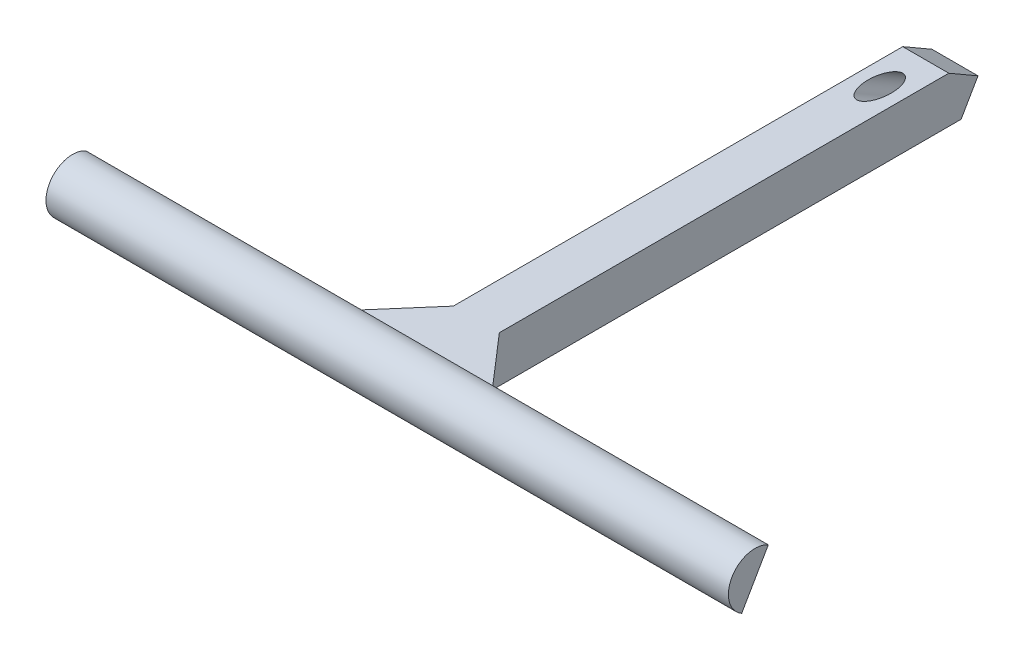
ISO-10303-21;
HEADER;
FILE_DESCRIPTION(('STEP AP214'),'2;1');
FILE_NAME('part.step','',(''),(''),'','','');
FILE_SCHEMA(('AUTOMOTIVE_DESIGN { 1 0 10303 214 1 1 1 1 }'));
ENDSEC;
DATA;
#1=APPLICATION_CONTEXT('core data for automotive mechanical design processes');
#2=APPLICATION_PROTOCOL_DEFINITION('international standard','automotive_design',2000,#1);
#3=PRODUCT_CONTEXT('',#1,'mechanical');
#4=PRODUCT('Part','Part','',(#3));
#5=PRODUCT_RELATED_PRODUCT_CATEGORY('part','',(#4));
#6=PRODUCT_DEFINITION_FORMATION('','',#4);
#7=PRODUCT_DEFINITION_CONTEXT('part definition',#1,'design');
#8=PRODUCT_DEFINITION('design','',#6,#7);
#9=PRODUCT_DEFINITION_SHAPE('','',#8);
#10=(LENGTH_UNIT() NAMED_UNIT(*) SI_UNIT(.MILLI.,.METRE.));
#11=(NAMED_UNIT(*) PLANE_ANGLE_UNIT() SI_UNIT($,.RADIAN.));
#12=(NAMED_UNIT(*) SI_UNIT($,.STERADIAN.) SOLID_ANGLE_UNIT());
#13=UNCERTAINTY_MEASURE_WITH_UNIT(LENGTH_MEASURE(1.E-05),#10,'distance_accuracy_value','');
#14=(GEOMETRIC_REPRESENTATION_CONTEXT(3) GLOBAL_UNCERTAINTY_ASSIGNED_CONTEXT((#13)) GLOBAL_UNIT_ASSIGNED_CONTEXT((#10,
#11,#12)) REPRESENTATION_CONTEXT('',''));
#15=CARTESIAN_POINT('',(0.,0.,0.));
#16=DIRECTION('',(0.,0.,1.));
#17=DIRECTION('',(1.,0.,0.));
#18=AXIS2_PLACEMENT_3D('',#15,#16,#17);
#19=CARTESIAN_POINT('',(0.,2.7,0.));
#20=DIRECTION('',(0.,1.,0.));
#21=DIRECTION('',(0.,0.,1.));
#22=AXIS2_PLACEMENT_3D('',#19,#20,#21);
#23=PLANE('',#22);
#24=CARTESIAN_POINT('',(0.,2.7,-23.6765371804359));
#25=DIRECTION('',(0.,1.,0.));
#26=DIRECTION('',(0.,0.,-1.));
#27=AXIS2_PLACEMENT_3D('',#24,#25,#26);
#28=ELLIPSE('',#27,2.70000000000004,1.35);
#29=CARTESIAN_POINT('',(0.,2.7,-26.3765371804359));
#30=VERTEX_POINT('',#29);
#31=EDGE_CURVE('E162',#30,#30,#28,.T.);
#32=ORIENTED_EDGE('',*,*,#31,.F.);
#33=EDGE_LOOP('',(#32));
#34=FACE_BOUND('',#33,.T.);
#35=DIRECTION('',(0.,0.,-1.));
#36=VECTOR('',#35,1.);
#37=CARTESIAN_POINT('',(-2.7,2.7,0.));
#38=LINE('',#37,#36);
#39=CARTESIAN_POINT('',(-2.7,2.7,23.6088058544797));
#40=VERTEX_POINT('',#39);
#41=CARTESIAN_POINT('',(-2.7,2.7,-29.076537180436));
#42=VERTEX_POINT('',#41);
#43=EDGE_CURVE('E185',#40,#42,#38,.T.);
#44=ORIENTED_EDGE('',*,*,#43,.F.);
#45=DIRECTION('',(-0.654653670707974,0.,0.755928946018457));
#46=VECTOR('',#45,1.);
#47=CARTESIAN_POINT('',(0.220832231856313,2.7,20.2361193038398));
#48=LINE('',#47,#46);
#49=CARTESIAN_POINT('',(-7.69999999999999,2.7,29.382308546376));
#50=VERTEX_POINT('',#49);
#51=EDGE_CURVE('E204',#40,#50,#48,.T.);
#52=ORIENTED_EDGE('',*,*,#51,.T.);
#53=DIRECTION('',(-1.,0.,0.));
#54=VECTOR('',#53,1.);
#55=CARTESIAN_POINT('',(40.,2.7,29.382308546376));
#56=LINE('',#55,#54);
#57=CARTESIAN_POINT('',(7.70000000000005,2.7,29.382308546376));
#58=VERTEX_POINT('',#57);
#59=EDGE_CURVE('E225',#58,#50,#56,.T.);
#60=ORIENTED_EDGE('',*,*,#59,.F.);
#61=DIRECTION('',(0.654653670707981,0.,0.755928946018451));
#62=VECTOR('',#61,1.);
#63=CARTESIAN_POINT('',(4.64345348242944,2.7,25.852912636956));
#64=LINE('',#63,#62);
#65=CARTESIAN_POINT('',(2.7,2.7,23.6088058544798));
#66=VERTEX_POINT('',#65);
#67=EDGE_CURVE('E209',#58,#66,#64,.F.);
#68=ORIENTED_EDGE('',*,*,#67,.T.);
#69=DIRECTION('',(0.,0.,-1.));
#70=VECTOR('',#69,1.);
#71=CARTESIAN_POINT('',(2.7,2.7,0.));
#72=LINE('',#71,#70);
#73=CARTESIAN_POINT('',(2.7,2.7,-29.076537180436));
#74=VERTEX_POINT('',#73);
#75=EDGE_CURVE('E187',#66,#74,#72,.T.);
#76=ORIENTED_EDGE('',*,*,#75,.T.);
#77=DIRECTION('',(1.,0.,0.));
#78=VECTOR('',#77,1.);
#79=CARTESIAN_POINT('',(-2.7,2.7,-29.076537180436));
#80=LINE('',#79,#78);
#81=EDGE_CURVE('E179',#42,#74,#80,.T.);
#82=ORIENTED_EDGE('',*,*,#81,.F.);
#83=EDGE_LOOP('',(#44,#52,#60,#68,#76,#82));
#84=FACE_BOUND('',#83,.T.);
#85=ADVANCED_FACE('F76',(#34,#84),#23,.T.);
#86=CARTESIAN_POINT('',(-2.7,2.7,0.));
#87=DIRECTION('',(-1.,0.,0.));
#88=DIRECTION('',(0.,0.,1.));
#89=AXIS2_PLACEMENT_3D('',#86,#87,#88);
#90=PLANE('',#89);
#91=DIRECTION('',(0.,0.,-1.));
#92=VECTOR('',#91,1.);
#93=CARTESIAN_POINT('',(-2.7,-2.7,0.));
#94=LINE('',#93,#92);
#95=CARTESIAN_POINT('',(-2.7,-2.7,26.7264973081037));
#96=VERTEX_POINT('',#95);
#97=CARTESIAN_POINT('',(-2.7,-2.7,-30.5234628195641));
#98=VERTEX_POINT('',#97);
#99=EDGE_CURVE('E182',#96,#98,#94,.T.);
#100=ORIENTED_EDGE('',*,*,#99,.F.);
#101=DIRECTION('',(0.,0.866025403784439,-0.5));
#102=VECTOR('',#101,1.);
#103=CARTESIAN_POINT('',(-2.7,12.9229128114971,17.7066043908598));
#104=LINE('',#103,#102);
#105=EDGE_CURVE('E190',#96,#40,#104,.T.);
#106=ORIENTED_EDGE('',*,*,#105,.T.);
#107=ORIENTED_EDGE('',*,*,#43,.T.);
#108=DIRECTION('',(0.,0.499999999999995,0.866025403784441));
#109=VECTOR('',#108,1.);
#110=CARTESIAN_POINT('',(-2.7,14.6155099261701,-8.43826859021784));
#111=LINE('',#110,#109);
#112=CARTESIAN_POINT('',(-2.7,0.723462819564048,-32.5));
#113=VERTEX_POINT('',#112);
#114=EDGE_CURVE('E176',#113,#42,#111,.T.);
#115=ORIENTED_EDGE('',*,*,#114,.F.);
#116=DIRECTION('',(0.,0.866025403784442,-0.499999999999993));
#117=VECTOR('',#116,1.);
#118=CARTESIAN_POINT('',(-2.7,-13.892047106606,-24.0617314097822));
#119=LINE('',#118,#117);
#120=EDGE_CURVE('E168',#98,#113,#119,.T.);
#121=ORIENTED_EDGE('',*,*,#120,.F.);
#122=EDGE_LOOP('',(#100,#106,#107,#115,#121));
#123=FACE_BOUND('',#122,.T.);
#124=ADVANCED_FACE('F249',(#123),#90,.T.);
#125=CARTESIAN_POINT('',(2.7,2.7,0.));
#126=DIRECTION('',(-1.,0.,0.));
#127=DIRECTION('',(0.,0.,1.));
#128=AXIS2_PLACEMENT_3D('',#125,#126,#127);
#129=PLANE('',#128);
#130=ORIENTED_EDGE('',*,*,#75,.F.);
#131=DIRECTION('',(0.,-0.866025403784439,0.5));
#132=VECTOR('',#131,1.);
#133=CARTESIAN_POINT('',(2.7,-5.2,28.1698729810778));
#134=LINE('',#133,#132);
#135=CARTESIAN_POINT('',(2.7,-2.7,26.7264973081037));
#136=VERTEX_POINT('',#135);
#137=EDGE_CURVE('E202',#66,#136,#134,.T.);
#138=ORIENTED_EDGE('',*,*,#137,.T.);
#139=DIRECTION('',(0.,0.,-1.));
#140=VECTOR('',#139,1.);
#141=CARTESIAN_POINT('',(2.7,-2.7,0.));
#142=LINE('',#141,#140);
#143=CARTESIAN_POINT('',(2.7,-2.7,-30.5234628195641));
#144=VERTEX_POINT('',#143);
#145=EDGE_CURVE('E188',#136,#144,#142,.T.);
#146=ORIENTED_EDGE('',*,*,#145,.T.);
#147=DIRECTION('',(0.,0.866025403784442,-0.499999999999993));
#148=VECTOR('',#147,1.);
#149=CARTESIAN_POINT('',(2.7,-13.892047106606,-24.0617314097822));
#150=LINE('',#149,#148);
#151=CARTESIAN_POINT('',(2.7,0.723462819564048,-32.5));
#152=VERTEX_POINT('',#151);
#153=EDGE_CURVE('E167',#144,#152,#150,.T.);
#154=ORIENTED_EDGE('',*,*,#153,.T.);
#155=DIRECTION('',(0.,0.499999999999995,0.866025403784441));
#156=VECTOR('',#155,1.);
#157=CARTESIAN_POINT('',(2.7,14.6155099261701,-8.43826859021784));
#158=LINE('',#157,#156);
#159=EDGE_CURVE('E170',#152,#74,#158,.T.);
#160=ORIENTED_EDGE('',*,*,#159,.T.);
#161=EDGE_LOOP('',(#130,#138,#146,#154,#160));
#162=FACE_BOUND('',#161,.T.);
#163=ADVANCED_FACE('F265',(#162),#129,.F.);
#164=CARTESIAN_POINT('',(0.,-2.7,0.));
#165=DIRECTION('',(0.,1.,0.));
#166=DIRECTION('',(0.,0.,1.));
#167=AXIS2_PLACEMENT_3D('',#164,#165,#166);
#168=PLANE('',#167);
#169=DIRECTION('',(1.,0.,0.));
#170=VECTOR('',#169,1.);
#171=CARTESIAN_POINT('',(-2.7,-2.7,-30.5234628195641));
#172=LINE('',#171,#170);
#173=CARTESIAN_POINT('',(-0.502299359073222,-2.7,-30.5234628195641));
#174=VERTEX_POINT('',#173);
#175=EDGE_CURVE('E161',#98,#174,#172,.T.);
#176=ORIENTED_EDGE('',*,*,#175,.T.);
#177=CARTESIAN_POINT('',(0.,-2.7,-33.029611541308));
#178=DIRECTION('',(0.,1.,0.));
#179=DIRECTION('',(0.,0.,-1.));
#180=AXIS2_PLACEMENT_3D('',#177,#178,#179);
#181=ELLIPSE('',#180,2.70000000000004,1.35);
#182=CARTESIAN_POINT('',(0.502299359073221,-2.7,-30.5234628195641));
#183=VERTEX_POINT('',#182);
#184=EDGE_CURVE('E90',#174,#183,#181,.T.);
#185=ORIENTED_EDGE('',*,*,#184,.T.);
#186=EDGE_CURVE('E159',#183,#144,#172,.T.);
#187=ORIENTED_EDGE('',*,*,#186,.T.);
#188=ORIENTED_EDGE('',*,*,#145,.F.);
#189=DIRECTION('',(-0.654653670707981,0.,-0.755928946018451));
#190=VECTOR('',#189,1.);
#191=CARTESIAN_POINT('',(-11.6833289274253,-2.7,10.11805965192));
#192=LINE('',#191,#190);
#193=CARTESIAN_POINT('',(7.70000000000005,-2.7,32.5));
#194=VERTEX_POINT('',#193);
#195=EDGE_CURVE('E85',#136,#194,#192,.F.);
#196=ORIENTED_EDGE('',*,*,#195,.T.);
#197=DIRECTION('',(-1.,0.,0.));
#198=VECTOR('',#197,1.);
#199=CARTESIAN_POINT('',(0.,-2.7,32.5));
#200=LINE('',#199,#198);
#201=CARTESIAN_POINT('',(-7.69999999999999,-2.7,32.5));
#202=VERTEX_POINT('',#201);
#203=EDGE_CURVE('E98',#194,#202,#200,.T.);
#204=ORIENTED_EDGE('',*,*,#203,.T.);
#205=DIRECTION('',(0.654653670707974,0.,-0.755928946018457));
#206=VECTOR('',#205,1.);
#207=CARTESIAN_POINT('',(11.6833289274252,-2.7,10.1180596519198));
#208=LINE('',#207,#206);
#209=EDGE_CURVE('E207',#202,#96,#208,.T.);
#210=ORIENTED_EDGE('',*,*,#209,.T.);
#211=ORIENTED_EDGE('',*,*,#99,.T.);
#212=EDGE_LOOP('',(#176,#185,#187,#188,#196,#204,#210,#211));
#213=FACE_BOUND('',#212,.T.);
#214=ADVANCED_FACE('F157',(#213),#168,.F.);
#215=CARTESIAN_POINT('',(-2.7,14.6155099261701,-8.43826859021784));
#216=DIRECTION('',(0.,0.866025403784441,-0.499999999999995));
#217=DIRECTION('',(0.,0.499999999999995,0.866025403784441));
#218=AXIS2_PLACEMENT_3D('',#215,#216,#217);
#219=PLANE('',#218);
#220=DIRECTION('',(1.,0.,0.));
#221=VECTOR('',#220,1.);
#222=CARTESIAN_POINT('',(-2.7,0.723462819564048,-32.5));
#223=LINE('',#222,#221);
#224=EDGE_CURVE('E180',#113,#152,#223,.T.);
#225=ORIENTED_EDGE('',*,*,#224,.F.);
#226=ORIENTED_EDGE('',*,*,#114,.T.);
#227=ORIENTED_EDGE('',*,*,#81,.T.);
#228=ORIENTED_EDGE('',*,*,#159,.F.);
#229=EDGE_LOOP('',(#225,#226,#227,#228));
#230=FACE_BOUND('',#229,.T.);
#231=ADVANCED_FACE('F261',(#230),#219,.T.);
#232=CARTESIAN_POINT('',(-2.7,-13.892047106606,-24.0617314097822));
#233=DIRECTION('',(0.,-0.499999999999993,-0.866025403784442));
#234=DIRECTION('',(0.,0.866025403784442,-0.499999999999993));
#235=AXIS2_PLACEMENT_3D('',#232,#233,#234);
#236=PLANE('',#235);
#237=CARTESIAN_POINT('',(0.,-1.61480577065394,-31.15));
#238=DIRECTION('',(0.,-0.499999999999993,-0.866025403784442));
#239=DIRECTION('',(0.,0.866025403784442,-0.499999999999993));
#240=AXIS2_PLACEMENT_3D('',#237,#238,#239);
#241=CIRCLE('',#240,1.35);
#242=EDGE_CURVE('E12',#174,#183,#241,.T.);
#243=ORIENTED_EDGE('',*,*,#242,.F.);
#244=ORIENTED_EDGE('',*,*,#175,.F.);
#245=ORIENTED_EDGE('',*,*,#120,.T.);
#246=ORIENTED_EDGE('',*,*,#224,.T.);
#247=ORIENTED_EDGE('',*,*,#153,.F.);
#248=ORIENTED_EDGE('',*,*,#186,.F.);
#249=EDGE_LOOP('',(#243,#244,#245,#246,#247,#248));
#250=FACE_BOUND('',#249,.T.);
#251=ADVANCED_FACE('F165',(#250),#236,.T.);
#252=CARTESIAN_POINT('',(40.,13.3979128114971,23.205865704891));
#253=DIRECTION('',(0.,0.5,0.866025403784439));
#254=DIRECTION('',(0.,-0.866025403784439,0.5));
#255=AXIS2_PLACEMENT_3D('',#252,#253,#254);
#256=PLANE('',#255);
#257=DIRECTION('',(-1.,0.,0.));
#258=VECTOR('',#257,1.);
#259=CARTESIAN_POINT('',(40.,-2.7,32.5));
#260=LINE('',#259,#258);
#261=CARTESIAN_POINT('',(40.,-2.7,32.5));
#262=VERTEX_POINT('',#261);
#263=EDGE_CURVE('E222',#262,#194,#260,.T.);
#264=ORIENTED_EDGE('',*,*,#263,.T.);
#265=DIRECTION('',(0.,0.866025403784439,-0.5));
#266=VECTOR('',#265,1.);
#267=CARTESIAN_POINT('',(7.70000000000005,2.7,29.382308546376));
#268=LINE('',#267,#266);
#269=EDGE_CURVE('E199',#194,#58,#268,.T.);
#270=ORIENTED_EDGE('',*,*,#269,.T.);
#271=CARTESIAN_POINT('',(40.,2.7,29.382308546376));
#272=VERTEX_POINT('',#271);
#273=EDGE_CURVE('E221',#272,#58,#56,.T.);
#274=ORIENTED_EDGE('',*,*,#273,.F.);
#275=DIRECTION('',(0.,0.866025403784439,-0.5));
#276=VECTOR('',#275,1.);
#277=CARTESIAN_POINT('',(40.,13.3979128114971,23.205865704891));
#278=LINE('',#277,#276);
#279=EDGE_CURVE('E237',#262,#272,#278,.T.);
#280=ORIENTED_EDGE('',*,*,#279,.F.);
#281=EDGE_LOOP('',(#264,#270,#274,#280));
#282=FACE_BOUND('',#281,.T.);
#283=ADVANCED_FACE('F219',(#282),#256,.F.);
#284=CARTESIAN_POINT('',(-40.,2.7,29.382308546376));
#285=VERTEX_POINT('',#284);
#286=EDGE_CURVE('E230',#50,#285,#56,.T.);
#287=ORIENTED_EDGE('',*,*,#286,.F.);
#288=DIRECTION('',(0.,-0.866025403784439,0.5));
#289=VECTOR('',#288,1.);
#290=CARTESIAN_POINT('',(-7.69999999999999,13.3979128114971,23.205865704891));
#291=LINE('',#290,#289);
#292=EDGE_CURVE('E196',#50,#202,#291,.T.);
#293=ORIENTED_EDGE('',*,*,#292,.T.);
#294=CARTESIAN_POINT('',(-40.,-2.7,32.5));
#295=VERTEX_POINT('',#294);
#296=EDGE_CURVE('E233',#202,#295,#260,.T.);
#297=ORIENTED_EDGE('',*,*,#296,.T.);
#298=DIRECTION('',(0.,0.866025403784439,-0.5));
#299=VECTOR('',#298,1.);
#300=CARTESIAN_POINT('',(-40.,13.3979128114971,23.205865704891));
#301=LINE('',#300,#299);
#302=EDGE_CURVE('E238',#295,#285,#301,.T.);
#303=ORIENTED_EDGE('',*,*,#302,.T.);
#304=EDGE_LOOP('',(#287,#293,#297,#303));
#305=FACE_BOUND('',#304,.T.);
#306=ADVANCED_FACE('F290',(#305),#256,.F.);
#307=CARTESIAN_POINT('',(40.,0.,30.941154273188));
#308=DIRECTION('',(-1.,0.,0.));
#309=DIRECTION('',(0.,0.,1.));
#310=AXIS2_PLACEMENT_3D('',#307,#308,#309);
#311=CYLINDRICAL_SURFACE('',#310,3.11769145362398);
#312=CARTESIAN_POINT('',(-40.,0.,30.941154273188));
#313=DIRECTION('',(1.,0.,0.));
#314=DIRECTION('',(0.,0.,-1.));
#315=AXIS2_PLACEMENT_3D('',#312,#313,#314);
#316=CIRCLE('',#315,3.11769145362398);
#317=EDGE_CURVE('E235',#285,#295,#316,.T.);
#318=ORIENTED_EDGE('',*,*,#317,.T.);
#319=ORIENTED_EDGE('',*,*,#296,.F.);
#320=ORIENTED_EDGE('',*,*,#203,.F.);
#321=ORIENTED_EDGE('',*,*,#263,.F.);
#322=CARTESIAN_POINT('',(40.,0.,30.941154273188));
#323=DIRECTION('',(1.,0.,0.));
#324=DIRECTION('',(0.,0.,-1.));
#325=AXIS2_PLACEMENT_3D('',#322,#323,#324);
#326=CIRCLE('',#325,3.11769145362398);
#327=EDGE_CURVE('E227',#272,#262,#326,.T.);
#328=ORIENTED_EDGE('',*,*,#327,.F.);
#329=ORIENTED_EDGE('',*,*,#273,.T.);
#330=ORIENTED_EDGE('',*,*,#59,.T.);
#331=ORIENTED_EDGE('',*,*,#286,.T.);
#332=EDGE_LOOP('',(#318,#319,#320,#321,#328,#329,#330,#331));
#333=FACE_BOUND('',#332,.T.);
#334=ADVANCED_FACE('F224',(#333),#311,.T.);
#335=CARTESIAN_POINT('',(40.,0.,0.));
#336=DIRECTION('',(1.,0.,0.));
#337=DIRECTION('',(0.,0.,-1.));
#338=AXIS2_PLACEMENT_3D('',#335,#336,#337);
#339=PLANE('',#338);
#340=ORIENTED_EDGE('',*,*,#279,.T.);
#341=ORIENTED_EDGE('',*,*,#327,.T.);
#342=EDGE_LOOP('',(#340,#341));
#343=FACE_BOUND('',#342,.T.);
#344=ADVANCED_FACE('F285',(#343),#339,.T.);
#345=CARTESIAN_POINT('',(-40.,0.,0.));
#346=DIRECTION('',(1.,0.,0.));
#347=DIRECTION('',(0.,0.,-1.));
#348=AXIS2_PLACEMENT_3D('',#345,#346,#347);
#349=PLANE('',#348);
#350=ORIENTED_EDGE('',*,*,#302,.F.);
#351=ORIENTED_EDGE('',*,*,#317,.F.);
#352=EDGE_LOOP('',(#350,#351));
#353=FACE_BOUND('',#352,.T.);
#354=ADVANCED_FACE('F279',(#353),#349,.F.);
#355=CARTESIAN_POINT('',(-2.7,12.9229128114971,17.7066043908598));
#356=DIRECTION('',(0.70710678118655,0.353553390593272,0.612372435695792));
#357=DIRECTION('',(0.,0.866025403784439,-0.5));
#358=AXIS2_PLACEMENT_3D('',#355,#356,#357);
#359=PLANE('',#358);
#360=ORIENTED_EDGE('',*,*,#209,.F.);
#361=ORIENTED_EDGE('',*,*,#292,.F.);
#362=ORIENTED_EDGE('',*,*,#51,.F.);
#363=ORIENTED_EDGE('',*,*,#105,.F.);
#364=EDGE_LOOP('',(#360,#361,#362,#363));
#365=FACE_BOUND('',#364,.T.);
#366=ADVANCED_FACE('F275',(#365),#359,.F.);
#367=CARTESIAN_POINT('',(7.70000000000005,13.3979128114971,23.205865704891));
#368=DIRECTION('',(0.707106781186544,-0.353553390593276,-0.612372435695798));
#369=DIRECTION('',(0.,-0.866025403784439,0.5));
#370=AXIS2_PLACEMENT_3D('',#367,#368,#369);
#371=PLANE('',#370);
#372=ORIENTED_EDGE('',*,*,#195,.F.);
#373=ORIENTED_EDGE('',*,*,#137,.F.);
#374=ORIENTED_EDGE('',*,*,#67,.F.);
#375=ORIENTED_EDGE('',*,*,#269,.F.);
#376=EDGE_LOOP('',(#372,#373,#374,#375));
#377=FACE_BOUND('',#376,.T.);
#378=ADVANCED_FACE('F79',(#377),#371,.T.);
#379=CARTESIAN_POINT('',(0.,27.804577010855,19.8058657048914));
#380=DIRECTION('',(0.,-0.499999999999993,-0.866025403784442));
#381=DIRECTION('',(0.,0.866025403784443,-0.499999999999993));
#382=AXIS2_PLACEMENT_3D('',#379,#380,#381);
#383=CYLINDRICAL_SURFACE('',#382,1.35);
#384=ORIENTED_EDGE('',*,*,#31,.T.);
#385=EDGE_LOOP('',(#384));
#386=FACE_BOUND('',#385,.T.);
#387=ORIENTED_EDGE('',*,*,#242,.T.);
#388=ORIENTED_EDGE('',*,*,#184,.F.);
#389=EDGE_LOOP('',(#387,#388));
#390=FACE_BOUND('',#389,.T.);
#391=ADVANCED_FACE('F151',(#386,#390),#383,.F.);
#392=CLOSED_SHELL('',(#85,#124,#163,#214,#231,#251,#283,#306,#334,#344,#354,#366,#378,#391));
#393=MANIFOLD_SOLID_BREP('B2',#392);
#394=ADVANCED_BREP_SHAPE_REPRESENTATION('',(#18,#393),#14);
#395=SHAPE_DEFINITION_REPRESENTATION(#9,#394);
ENDSEC;
END-ISO-10303-21;
